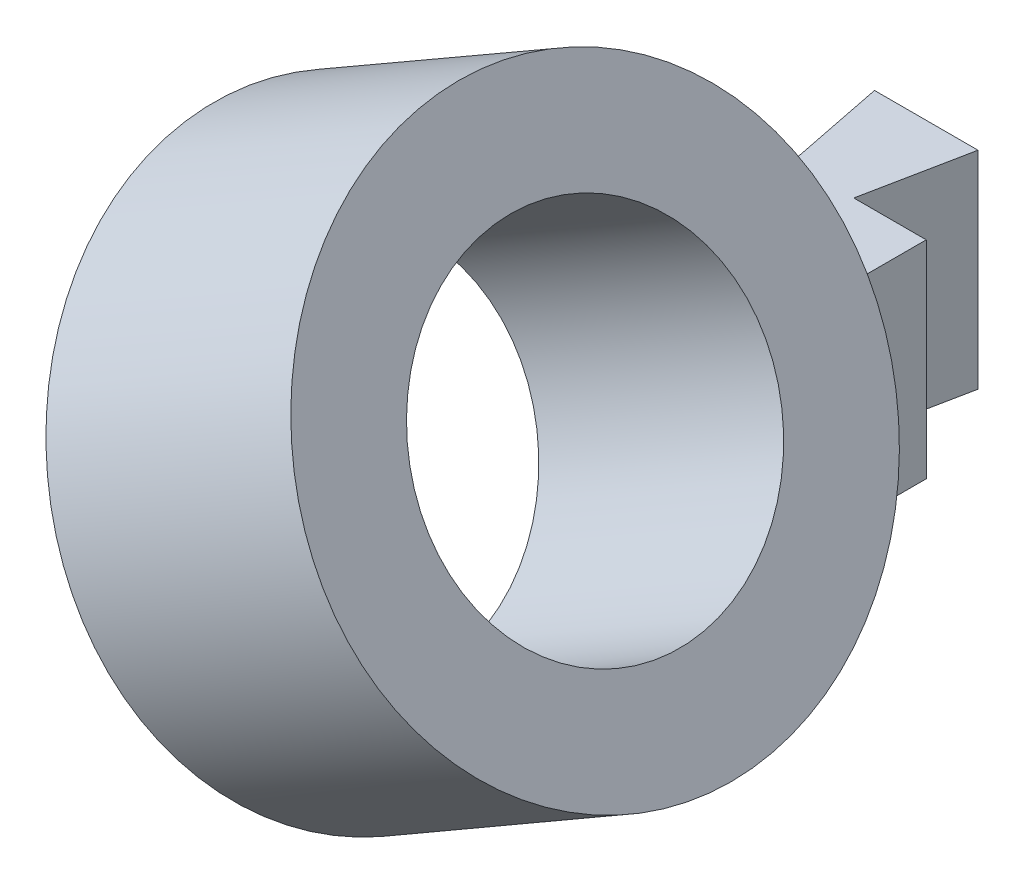
ISO-10303-21;
HEADER;
FILE_DESCRIPTION(('STEP AP214'),'2;1');
FILE_NAME('part.step','',(''),(''),'','','');
FILE_SCHEMA(('AUTOMOTIVE_DESIGN { 1 0 10303 214 1 1 1 1 }'));
ENDSEC;
DATA;
#1=APPLICATION_CONTEXT('core data for automotive mechanical design processes');
#2=APPLICATION_PROTOCOL_DEFINITION('international standard','automotive_design',2000,#1);
#3=PRODUCT_CONTEXT('',#1,'mechanical');
#4=PRODUCT('Part','Part','',(#3));
#5=PRODUCT_RELATED_PRODUCT_CATEGORY('part','',(#4));
#6=PRODUCT_DEFINITION_FORMATION('','',#4);
#7=PRODUCT_DEFINITION_CONTEXT('part definition',#1,'design');
#8=PRODUCT_DEFINITION('design','',#6,#7);
#9=PRODUCT_DEFINITION_SHAPE('','',#8);
#10=(LENGTH_UNIT() NAMED_UNIT(*) SI_UNIT(.MILLI.,.METRE.));
#11=(NAMED_UNIT(*) PLANE_ANGLE_UNIT() SI_UNIT($,.RADIAN.));
#12=(NAMED_UNIT(*) SI_UNIT($,.STERADIAN.) SOLID_ANGLE_UNIT());
#13=UNCERTAINTY_MEASURE_WITH_UNIT(LENGTH_MEASURE(1.E-05),#10,'distance_accuracy_value','');
#14=(GEOMETRIC_REPRESENTATION_CONTEXT(3) GLOBAL_UNCERTAINTY_ASSIGNED_CONTEXT((#13)) GLOBAL_UNIT_ASSIGNED_CONTEXT((#10,
#11,#12)) REPRESENTATION_CONTEXT('',''));
#15=CARTESIAN_POINT('',(0.,0.,0.));
#16=DIRECTION('',(0.,0.,1.));
#17=DIRECTION('',(1.,0.,0.));
#18=AXIS2_PLACEMENT_3D('',#15,#16,#17);
#19=CARTESIAN_POINT('',(-11.8301270189222,3.16987298107775,16.));
#20=DIRECTION('',(0.866025403784436,0.500000000000004,0.));
#21=DIRECTION('',(-0.500000000000004,0.866025403784436,0.));
#22=AXIS2_PLACEMENT_3D('',#19,#20,#21);
#23=CYLINDRICAL_SURFACE('',#22,13.15);
#24=CARTESIAN_POINT('',(0.,10.,16.));
#25=DIRECTION('',(0.,-1.,0.));
#26=DIRECTION('',(1.,0.,0.));
#27=AXIS2_PLACEMENT_3D('',#24,#25,#26);
#28=ELLIPSE('',#27,26.2999999999998,13.15);
#29=CARTESIAN_POINT('',(0.,10.,2.85));
#30=VERTEX_POINT('',#29);
#31=CARTESIAN_POINT('',(-10.,10.,3.83766058687723));
#32=VERTEX_POINT('',#31);
#33=EDGE_CURVE('E194',#30,#32,#28,.F.);
#34=ORIENTED_EDGE('',*,*,#33,.T.);
#35=CARTESIAN_POINT('',(-10.,4.22649730810368,16.));
#36=DIRECTION('',(1.,0.,0.));
#37=DIRECTION('',(0.,1.,0.));
#38=AXIS2_PLACEMENT_3D('',#35,#36,#37);
#39=ELLIPSE('',#38,15.1843120796872,13.15);
#40=CARTESIAN_POINT('',(-9.99999999999999,0.,3.36967774051492));
#41=VERTEX_POINT('',#40);
#42=EDGE_CURVE('E188',#32,#41,#39,.F.);
#43=ORIENTED_EDGE('',*,*,#42,.T.);
#44=CARTESIAN_POINT('',(-11.8301270189222,3.16987298107775,16.));
#45=DIRECTION('',(-0.866025403784436,-0.500000000000004,0.));
#46=DIRECTION('',(0.500000000000004,-0.866025403784436,0.));
#47=AXIS2_PLACEMENT_3D('',#44,#45,#46);
#48=CIRCLE('',#47,13.15);
#49=EDGE_CURVE('E209',#41,#41,#48,.T.);
#50=ORIENTED_EDGE('',*,*,#49,.F.);
#51=CARTESIAN_POINT('',(-17.3205080756886,0.,16.));
#52=DIRECTION('',(0.,1.,0.));
#53=DIRECTION('',(1.,0.,0.));
#54=AXIS2_PLACEMENT_3D('',#51,#52,#53);
#55=ELLIPSE('',#54,26.2999999999998,13.15);
#56=CARTESIAN_POINT('',(0.,0.,6.10442017868582));
#57=VERTEX_POINT('',#56);
#58=EDGE_CURVE('E146',#41,#57,#55,.F.);
#59=ORIENTED_EDGE('',*,*,#58,.T.);
#60=CARTESIAN_POINT('',(0.,10.,16.));
#61=DIRECTION('',(-1.,0.,0.));
#62=DIRECTION('',(0.,1.,0.));
#63=AXIS2_PLACEMENT_3D('',#60,#61,#62);
#64=ELLIPSE('',#63,15.1843120796872,13.15);
#65=EDGE_CURVE('E191',#57,#30,#64,.F.);
#66=ORIENTED_EDGE('',*,*,#65,.T.);
#67=CARTESIAN_POINT('',(0.,10.,16.));
#68=DIRECTION('',(-0.866025403784436,-0.500000000000004,0.));
#69=DIRECTION('',(0.500000000000004,-0.866025403784436,0.));
#70=AXIS2_PLACEMENT_3D('',#67,#68,#69);
#71=CIRCLE('',#70,13.15);
#72=EDGE_CURVE('E207',#30,#30,#71,.T.);
#73=ORIENTED_EDGE('',*,*,#72,.T.);
#74=EDGE_LOOP('',(#34,#43,#50,#59,#66,#73));
#75=FACE_BOUND('',#74,.T.);
#76=ADVANCED_FACE('F41',(#75),#23,.T.);
#77=CARTESIAN_POINT('',(0.,10.,0.));
#78=DIRECTION('',(-1.,0.,0.));
#79=DIRECTION('',(0.,0.,1.));
#80=AXIS2_PLACEMENT_3D('',#77,#78,#79);
#81=PLANE('',#80);
#82=DIRECTION('',(0.,0.,-1.));
#83=VECTOR('',#82,1.);
#84=CARTESIAN_POINT('',(0.,0.,0.));
#85=LINE('',#84,#83);
#86=CARTESIAN_POINT('',(0.,0.,0.));
#87=VERTEX_POINT('',#86);
#88=EDGE_CURVE('E142',#57,#87,#85,.T.);
#89=ORIENTED_EDGE('',*,*,#88,.T.);
#90=DIRECTION('',(0.,-1.,0.));
#91=VECTOR('',#90,1.);
#92=CARTESIAN_POINT('',(0.,10.,0.));
#93=LINE('',#92,#91);
#94=CARTESIAN_POINT('',(0.,10.,0.));
#95=VERTEX_POINT('',#94);
#96=EDGE_CURVE('E11',#95,#87,#93,.T.);
#97=ORIENTED_EDGE('',*,*,#96,.F.);
#98=DIRECTION('',(0.,0.,-1.));
#99=VECTOR('',#98,1.);
#100=CARTESIAN_POINT('',(0.,10.,0.));
#101=LINE('',#100,#99);
#102=EDGE_CURVE('E98',#30,#95,#101,.T.);
#103=ORIENTED_EDGE('',*,*,#102,.F.);
#104=ORIENTED_EDGE('',*,*,#65,.F.);
#105=EDGE_LOOP('',(#89,#97,#103,#104));
#106=FACE_BOUND('',#105,.T.);
#107=ADVANCED_FACE('F43',(#106),#81,.F.);
#108=CARTESIAN_POINT('',(0.,10.,0.));
#109=DIRECTION('',(0.,0.,1.));
#110=DIRECTION('',(1.,0.,0.));
#111=AXIS2_PLACEMENT_3D('',#108,#109,#110);
#112=PLANE('',#111);
#113=DIRECTION('',(-1.,0.,0.));
#114=VECTOR('',#113,1.);
#115=CARTESIAN_POINT('',(0.,0.,0.));
#116=LINE('',#115,#114);
#117=CARTESIAN_POINT('',(-3.5,0.,0.));
#118=VERTEX_POINT('',#117);
#119=EDGE_CURVE('E145',#87,#118,#116,.T.);
#120=ORIENTED_EDGE('',*,*,#119,.T.);
#121=DIRECTION('',(0.,-1.,0.));
#122=VECTOR('',#121,1.);
#123=CARTESIAN_POINT('',(-3.5,10.,0.));
#124=LINE('',#123,#122);
#125=CARTESIAN_POINT('',(-3.5,10.,0.));
#126=VERTEX_POINT('',#125);
#127=EDGE_CURVE('E51',#126,#118,#124,.T.);
#128=ORIENTED_EDGE('',*,*,#127,.F.);
#129=DIRECTION('',(-1.,0.,0.));
#130=VECTOR('',#129,1.);
#131=CARTESIAN_POINT('',(0.,10.,0.));
#132=LINE('',#131,#130);
#133=EDGE_CURVE('E223',#95,#126,#132,.T.);
#134=ORIENTED_EDGE('',*,*,#133,.F.);
#135=ORIENTED_EDGE('',*,*,#96,.T.);
#136=EDGE_LOOP('',(#120,#128,#134,#135));
#137=FACE_BOUND('',#136,.T.);
#138=ADVANCED_FACE('F226',(#137),#112,.F.);
#139=CARTESIAN_POINT('',(-3.36538461538462,10.,-0.673076923076922));
#140=DIRECTION('',(-0.98058067569092,0.,-0.196116135138184));
#141=DIRECTION('',(-0.196116135138184,0.,0.98058067569092));
#142=AXIS2_PLACEMENT_3D('',#139,#140,#141);
#143=PLANE('',#142);
#144=DIRECTION('',(0.196116135138184,0.,-0.98058067569092));
#145=VECTOR('',#144,1.);
#146=CARTESIAN_POINT('',(-3.36538461538462,0.,-0.673076923076922));
#147=LINE('',#146,#145);
#148=CARTESIAN_POINT('',(-2.5,0.,-5.));
#149=VERTEX_POINT('',#148);
#150=EDGE_CURVE('E149',#118,#149,#147,.T.);
#151=ORIENTED_EDGE('',*,*,#150,.T.);
#152=DIRECTION('',(0.,-1.,0.));
#153=VECTOR('',#152,1.);
#154=CARTESIAN_POINT('',(-2.5,10.,-5.));
#155=LINE('',#154,#153);
#156=CARTESIAN_POINT('',(-2.5,10.,-5.));
#157=VERTEX_POINT('',#156);
#158=EDGE_CURVE('E128',#157,#149,#155,.T.);
#159=ORIENTED_EDGE('',*,*,#158,.F.);
#160=DIRECTION('',(0.196116135138184,0.,-0.98058067569092));
#161=VECTOR('',#160,1.);
#162=CARTESIAN_POINT('',(-3.36538461538462,10.,-0.673076923076922));
#163=LINE('',#162,#161);
#164=EDGE_CURVE('E117',#126,#157,#163,.T.);
#165=ORIENTED_EDGE('',*,*,#164,.F.);
#166=ORIENTED_EDGE('',*,*,#127,.T.);
#167=EDGE_LOOP('',(#151,#159,#165,#166));
#168=FACE_BOUND('',#167,.T.);
#169=ADVANCED_FACE('F172',(#168),#143,.F.);
#170=CARTESIAN_POINT('',(0.,10.,-5.));
#171=DIRECTION('',(0.,0.,1.));
#172=DIRECTION('',(1.,0.,0.));
#173=AXIS2_PLACEMENT_3D('',#170,#171,#172);
#174=PLANE('',#173);
#175=DIRECTION('',(-1.,0.,0.));
#176=VECTOR('',#175,1.);
#177=CARTESIAN_POINT('',(0.,0.,-5.));
#178=LINE('',#177,#176);
#179=CARTESIAN_POINT('',(-7.5,0.,-5.));
#180=VERTEX_POINT('',#179);
#181=EDGE_CURVE('E126',#149,#180,#178,.T.);
#182=ORIENTED_EDGE('',*,*,#181,.T.);
#183=DIRECTION('',(0.,-1.,0.));
#184=VECTOR('',#183,1.);
#185=CARTESIAN_POINT('',(-7.5,10.,-5.));
#186=LINE('',#185,#184);
#187=CARTESIAN_POINT('',(-7.5,10.,-5.));
#188=VERTEX_POINT('',#187);
#189=EDGE_CURVE('E123',#188,#180,#186,.T.);
#190=ORIENTED_EDGE('',*,*,#189,.F.);
#191=DIRECTION('',(-1.,0.,0.));
#192=VECTOR('',#191,1.);
#193=CARTESIAN_POINT('',(0.,10.,-5.));
#194=LINE('',#193,#192);
#195=EDGE_CURVE('E111',#157,#188,#194,.T.);
#196=ORIENTED_EDGE('',*,*,#195,.F.);
#197=ORIENTED_EDGE('',*,*,#158,.T.);
#198=EDGE_LOOP('',(#182,#190,#196,#197));
#199=FACE_BOUND('',#198,.T.);
#200=ADVANCED_FACE('F124',(#199),#174,.F.);
#201=CARTESIAN_POINT('',(-6.25,10.,1.25));
#202=DIRECTION('',(0.98058067569092,0.,-0.196116135138184));
#203=DIRECTION('',(-0.196116135138184,0.,-0.98058067569092));
#204=AXIS2_PLACEMENT_3D('',#201,#202,#203);
#205=PLANE('',#204);
#206=DIRECTION('',(0.196116135138184,0.,0.98058067569092));
#207=VECTOR('',#206,1.);
#208=CARTESIAN_POINT('',(-6.25,0.,1.25));
#209=LINE('',#208,#207);
#210=CARTESIAN_POINT('',(-6.5,0.,0.));
#211=VERTEX_POINT('',#210);
#212=EDGE_CURVE('E83',#180,#211,#209,.T.);
#213=ORIENTED_EDGE('',*,*,#212,.T.);
#214=DIRECTION('',(0.,-1.,0.));
#215=VECTOR('',#214,1.);
#216=CARTESIAN_POINT('',(-6.5,10.,0.));
#217=LINE('',#216,#215);
#218=CARTESIAN_POINT('',(-6.5,10.,0.));
#219=VERTEX_POINT('',#218);
#220=EDGE_CURVE('E129',#219,#211,#217,.T.);
#221=ORIENTED_EDGE('',*,*,#220,.F.);
#222=DIRECTION('',(0.196116135138184,0.,0.98058067569092));
#223=VECTOR('',#222,1.);
#224=CARTESIAN_POINT('',(-6.25,10.,1.25));
#225=LINE('',#224,#223);
#226=EDGE_CURVE('E115',#188,#219,#225,.T.);
#227=ORIENTED_EDGE('',*,*,#226,.F.);
#228=ORIENTED_EDGE('',*,*,#189,.T.);
#229=EDGE_LOOP('',(#213,#221,#227,#228));
#230=FACE_BOUND('',#229,.T.);
#231=ADVANCED_FACE('F131',(#230),#205,.F.);
#232=CARTESIAN_POINT('',(0.,10.,0.));
#233=DIRECTION('',(0.,0.,1.));
#234=DIRECTION('',(1.,0.,0.));
#235=AXIS2_PLACEMENT_3D('',#232,#233,#234);
#236=PLANE('',#235);
#237=DIRECTION('',(-1.,0.,0.));
#238=VECTOR('',#237,1.);
#239=CARTESIAN_POINT('',(0.,0.,0.));
#240=LINE('',#239,#238);
#241=CARTESIAN_POINT('',(-10.,0.,0.));
#242=VERTEX_POINT('',#241);
#243=EDGE_CURVE('E89',#211,#242,#240,.T.);
#244=ORIENTED_EDGE('',*,*,#243,.T.);
#245=DIRECTION('',(0.,-1.,0.));
#246=VECTOR('',#245,1.);
#247=CARTESIAN_POINT('',(-10.,10.,0.));
#248=LINE('',#247,#246);
#249=CARTESIAN_POINT('',(-10.,10.,0.));
#250=VERTEX_POINT('',#249);
#251=EDGE_CURVE('E141',#250,#242,#248,.T.);
#252=ORIENTED_EDGE('',*,*,#251,.F.);
#253=DIRECTION('',(-1.,0.,0.));
#254=VECTOR('',#253,1.);
#255=CARTESIAN_POINT('',(0.,10.,0.));
#256=LINE('',#255,#254);
#257=EDGE_CURVE('E59',#219,#250,#256,.T.);
#258=ORIENTED_EDGE('',*,*,#257,.F.);
#259=ORIENTED_EDGE('',*,*,#220,.T.);
#260=EDGE_LOOP('',(#244,#252,#258,#259));
#261=FACE_BOUND('',#260,.T.);
#262=ADVANCED_FACE('F260',(#261),#236,.F.);
#263=CARTESIAN_POINT('',(-10.,10.,0.));
#264=DIRECTION('',(1.,0.,0.));
#265=DIRECTION('',(0.,0.,-1.));
#266=AXIS2_PLACEMENT_3D('',#263,#264,#265);
#267=PLANE('',#266);
#268=DIRECTION('',(0.,0.,1.));
#269=VECTOR('',#268,1.);
#270=CARTESIAN_POINT('',(-10.,0.,0.));
#271=LINE('',#270,#269);
#272=EDGE_CURVE('E158',#242,#41,#271,.T.);
#273=ORIENTED_EDGE('',*,*,#272,.T.);
#274=ORIENTED_EDGE('',*,*,#42,.F.);
#275=DIRECTION('',(0.,0.,1.));
#276=VECTOR('',#275,1.);
#277=CARTESIAN_POINT('',(-10.,10.,0.));
#278=LINE('',#277,#276);
#279=EDGE_CURVE('E135',#250,#32,#278,.T.);
#280=ORIENTED_EDGE('',*,*,#279,.F.);
#281=ORIENTED_EDGE('',*,*,#251,.T.);
#282=EDGE_LOOP('',(#273,#274,#280,#281));
#283=FACE_BOUND('',#282,.T.);
#284=ADVANCED_FACE('F185',(#283),#267,.F.);
#285=CARTESIAN_POINT('',(0.,10.,0.));
#286=DIRECTION('',(0.,1.,0.));
#287=DIRECTION('',(0.,0.,1.));
#288=AXIS2_PLACEMENT_3D('',#285,#286,#287);
#289=PLANE('',#288);
#290=ORIENTED_EDGE('',*,*,#279,.T.);
#291=ORIENTED_EDGE('',*,*,#33,.F.);
#292=ORIENTED_EDGE('',*,*,#102,.T.);
#293=ORIENTED_EDGE('',*,*,#133,.T.);
#294=ORIENTED_EDGE('',*,*,#164,.T.);
#295=ORIENTED_EDGE('',*,*,#195,.T.);
#296=ORIENTED_EDGE('',*,*,#226,.T.);
#297=ORIENTED_EDGE('',*,*,#257,.T.);
#298=EDGE_LOOP('',(#290,#291,#292,#293,#294,#295,#296,#297));
#299=FACE_BOUND('',#298,.T.);
#300=ADVANCED_FACE('F113',(#299),#289,.T.);
#301=CARTESIAN_POINT('',(0.,0.,0.));
#302=DIRECTION('',(0.,1.,0.));
#303=DIRECTION('',(0.,0.,1.));
#304=AXIS2_PLACEMENT_3D('',#301,#302,#303);
#305=PLANE('',#304);
#306=ORIENTED_EDGE('',*,*,#88,.F.);
#307=ORIENTED_EDGE('',*,*,#58,.F.);
#308=ORIENTED_EDGE('',*,*,#272,.F.);
#309=ORIENTED_EDGE('',*,*,#243,.F.);
#310=ORIENTED_EDGE('',*,*,#212,.F.);
#311=ORIENTED_EDGE('',*,*,#181,.F.);
#312=ORIENTED_EDGE('',*,*,#150,.F.);
#313=ORIENTED_EDGE('',*,*,#119,.F.);
#314=EDGE_LOOP('',(#306,#307,#308,#309,#310,#311,#312,#313));
#315=FACE_BOUND('',#314,.T.);
#316=ADVANCED_FACE('F178',(#315),#305,.F.);
#317=CARTESIAN_POINT('',(-11.8301270189222,3.16987298107775,16.));
#318=DIRECTION('',(-0.866025403784436,-0.500000000000004,0.));
#319=DIRECTION('',(0.500000000000004,-0.866025403784436,0.));
#320=AXIS2_PLACEMENT_3D('',#317,#318,#319);
#321=PLANE('',#320);
#322=ORIENTED_EDGE('',*,*,#49,.T.);
#323=EDGE_LOOP('',(#322));
#324=FACE_BOUND('',#323,.T.);
#325=CARTESIAN_POINT('',(-11.8301270189222,3.16987298107775,16.));
#326=DIRECTION('',(-0.866025403784436,-0.500000000000004,0.));
#327=DIRECTION('',(0.500000000000004,-0.866025403784436,0.));
#328=AXIS2_PLACEMENT_3D('',#325,#326,#327);
#329=CIRCLE('',#328,8.15);
#330=CARTESIAN_POINT('',(-15.9051270189222,10.2279800219209,16.));
#331=VERTEX_POINT('',#330);
#332=EDGE_CURVE('E202',#331,#331,#329,.T.);
#333=ORIENTED_EDGE('',*,*,#332,.F.);
#334=EDGE_LOOP('',(#333));
#335=FACE_BOUND('',#334,.T.);
#336=ADVANCED_FACE('F229',(#324,#335),#321,.T.);
#337=CARTESIAN_POINT('',(0.,10.,16.));
#338=DIRECTION('',(-0.866025403784436,-0.500000000000004,0.));
#339=DIRECTION('',(0.500000000000004,-0.866025403784436,0.));
#340=AXIS2_PLACEMENT_3D('',#337,#338,#339);
#341=PLANE('',#340);
#342=ORIENTED_EDGE('',*,*,#72,.F.);
#343=EDGE_LOOP('',(#342));
#344=FACE_BOUND('',#343,.T.);
#345=CARTESIAN_POINT('',(0.,10.,16.));
#346=DIRECTION('',(-0.866025403784436,-0.500000000000004,0.));
#347=DIRECTION('',(0.500000000000004,-0.866025403784436,0.));
#348=AXIS2_PLACEMENT_3D('',#345,#346,#347);
#349=CIRCLE('',#348,8.15);
#350=CARTESIAN_POINT('',(-4.07500000000002,17.0581070408432,16.));
#351=VERTEX_POINT('',#350);
#352=EDGE_CURVE('E198',#351,#351,#349,.T.);
#353=ORIENTED_EDGE('',*,*,#352,.T.);
#354=EDGE_LOOP('',(#353));
#355=FACE_BOUND('',#354,.T.);
#356=ADVANCED_FACE('F232',(#344,#355),#341,.F.);
#357=CARTESIAN_POINT('',(-11.8301270189222,3.16987298107775,16.));
#358=DIRECTION('',(0.866025403784436,0.500000000000004,0.));
#359=DIRECTION('',(-0.500000000000004,0.866025403784436,0.));
#360=AXIS2_PLACEMENT_3D('',#357,#358,#359);
#361=CYLINDRICAL_SURFACE('',#360,8.15);
#362=CARTESIAN_POINT('',(-15.9051270189222,10.2279800219209,16.));
#363=CARTESIAN_POINT('',(-15.7818965291418,10.299127178368,16.));
#364=CARTESIAN_POINT('',(-15.6586660393613,10.3702743348151,16.));
#365=CARTESIAN_POINT('',(-15.4122050598004,10.5125686477093,16.));
#366=CARTESIAN_POINT('',(-15.28897457002,10.5837158041564,16.));
#367=CARTESIAN_POINT('',(-15.0425135904591,10.7260101170507,16.));
#368=CARTESIAN_POINT('',(-14.9192831006787,10.7971572734978,16.));
#369=CARTESIAN_POINT('',(-14.6728221211178,10.939451586392,16.));
#370=CARTESIAN_POINT('',(-14.5495916313374,11.0105987428391,16.));
#371=CARTESIAN_POINT('',(-14.3031306517765,11.1528930557333,16.));
#372=CARTESIAN_POINT('',(-14.179900161996,11.2240402121804,16.));
#373=CARTESIAN_POINT('',(-13.9334391824352,11.3663345250746,16.));
#374=CARTESIAN_POINT('',(-13.8102086926547,11.4374816815217,16.));
#375=CARTESIAN_POINT('',(-13.5637477130938,11.5797759944159,16.));
#376=CARTESIAN_POINT('',(-13.4405172233134,11.650923150863,16.));
#377=CARTESIAN_POINT('',(-13.1940562437525,11.7932174637573,16.));
#378=CARTESIAN_POINT('',(-13.0708257539721,11.8643646202044,16.));
#379=CARTESIAN_POINT('',(-12.8243647744112,12.0066589330986,16.));
#380=CARTESIAN_POINT('',(-12.7011342846308,12.0778060895457,16.));
#381=CARTESIAN_POINT('',(-12.4546733050699,12.2201004024399,16.));
#382=CARTESIAN_POINT('',(-12.3314428152895,12.291247558887,16.));
#383=CARTESIAN_POINT('',(-12.0849818357286,12.4335418717812,16.));
#384=CARTESIAN_POINT('',(-11.9617513459481,12.5046890282283,16.));
#385=CARTESIAN_POINT('',(-11.7152903663873,12.6469833411225,16.));
#386=CARTESIAN_POINT('',(-11.5920598766068,12.7181304975696,16.));
#387=CARTESIAN_POINT('',(-11.3455988970459,12.8604248104639,16.));
#388=CARTESIAN_POINT('',(-11.2223684072655,12.931571966911,16.));
#389=CARTESIAN_POINT('',(-10.9759074277046,13.0738662798052,16.));
#390=CARTESIAN_POINT('',(-10.8526769379242,13.1450134362523,16.));
#391=CARTESIAN_POINT('',(-10.6062159583633,13.2873077491465,16.));
#392=CARTESIAN_POINT('',(-10.4829854685829,13.3584549055936,16.));
#393=CARTESIAN_POINT('',(-10.236524489022,13.5007492184878,16.));
#394=CARTESIAN_POINT('',(-10.1132939992415,13.5718963749349,16.));
#395=CARTESIAN_POINT('',(-9.86683301968067,13.7141906878291,16.));
#396=CARTESIAN_POINT('',(-9.74360252990023,13.7853378442762,16.));
#397=CARTESIAN_POINT('',(-9.49714155033935,13.9276321571705,16.));
#398=CARTESIAN_POINT('',(-9.37391106055891,13.9987793136176,16.));
#399=CARTESIAN_POINT('',(-9.12745008099803,14.1410736265118,16.));
#400=CARTESIAN_POINT('',(-9.00421959121759,14.2122207829589,16.));
#401=CARTESIAN_POINT('',(-8.75775861165671,14.3545150958531,16.));
#402=CARTESIAN_POINT('',(-8.63452812187627,14.4256622523002,16.));
#403=CARTESIAN_POINT('',(-8.3880671423154,14.5679565651944,16.));
#404=CARTESIAN_POINT('',(-8.26483665253496,14.6391037216415,16.));
#405=CARTESIAN_POINT('',(-8.01837567297408,14.7813980345357,16.));
#406=CARTESIAN_POINT('',(-7.89514518319364,14.8525451909829,16.));
#407=CARTESIAN_POINT('',(-7.64868420363276,14.9948395038771,16.));
#408=CARTESIAN_POINT('',(-7.52545371385232,15.0659866603242,16.));
#409=CARTESIAN_POINT('',(-7.27899273429144,15.2082809732184,16.));
#410=CARTESIAN_POINT('',(-7.155762244511,15.2794281296655,16.));
#411=CARTESIAN_POINT('',(-6.90930126495012,15.4217224425597,16.));
#412=CARTESIAN_POINT('',(-6.78607077516968,15.4928695990068,16.));
#413=CARTESIAN_POINT('',(-6.53960979560881,15.635163911901,16.));
#414=CARTESIAN_POINT('',(-6.41637930582837,15.7063110683481,16.));
#415=CARTESIAN_POINT('',(-6.16991832626749,15.8486053812423,16.));
#416=CARTESIAN_POINT('',(-6.04668783648705,15.9197525376895,16.));
#417=CARTESIAN_POINT('',(-5.80022685692617,16.0620468505837,16.));
#418=CARTESIAN_POINT('',(-5.67699636714573,16.1331940070308,16.));
#419=CARTESIAN_POINT('',(-5.43053538758485,16.275488319925,16.));
#420=CARTESIAN_POINT('',(-5.30730489780441,16.3466354763721,16.));
#421=CARTESIAN_POINT('',(-5.06084391824353,16.4889297892663,16.));
#422=CARTESIAN_POINT('',(-4.93761342846309,16.5600769457134,16.));
#423=CARTESIAN_POINT('',(-4.69115244890222,16.7023712586076,16.));
#424=CARTESIAN_POINT('',(-4.56792195912178,16.7735184150547,16.));
#425=CARTESIAN_POINT('',(-4.3214609795609,16.9158127279489,16.));
#426=CARTESIAN_POINT('',(-4.19823048978046,16.9869598843961,16.));
#427=CARTESIAN_POINT('',(-4.07500000000002,17.0581070408432,16.));
#428=B_SPLINE_CURVE_WITH_KNOTS('',3,(#362,#363,#364,#365,#366,#367,#368,#369,#370,#371,#372,
#373,#374,#375,#376,#377,#378,#379,#380,#381,#382,#383,#384,#385,#386,#387,#388,#389,#390,#391,
#392,#393,#394,#395,#396,#397,#398,#399,#400,#401,#402,#403,#404,#405,#406,#407,#408,#409,#410,
#411,#412,#413,#414,#415,#416,#417,#418,#419,#420,#421,#422,#423,#424,#425,#426,#427),
.UNSPECIFIED.,.F.,.F.,(4,2,2,2,2,2,2,2,2,2,2,2,2,2,2,2,2,2,2,2,2,2,2,2,2,2,2,2,2,2,2,2,4),(0.,
0.426882938682635,0.853765877365274,1.28064881604791,1.70753175473055,2.13441469341319,
2.56129763209582,2.98818057077846,3.4150635094611,3.84194644814374,4.26882938682638,
4.69571232550901,5.12259526419165,5.54947820287429,5.97636114155693,6.40324408023956,
6.8301270189222,7.25700995760484,7.68389289628748,8.11077583497012,8.53765877365275,
8.96454171233539,9.39142465101803,9.81830758970066,10.2451905283833,10.6720734670659,
11.0989564057486,11.5258393444312,11.9527222831139,12.3796052217965,12.8064881604791,
13.2333710991618,13.6602540378444),.UNSPECIFIED.);
#429=EDGE_CURVE('BSEAM236',#331,#351,#428,.T.);
#430=ORIENTED_EDGE('',*,*,#332,.T.);
#431=ORIENTED_EDGE('',*,*,#352,.F.);
#432=ORIENTED_EDGE('',*,*,#429,.T.);
#433=ORIENTED_EDGE('',*,*,#429,.F.);
#434=EDGE_LOOP('',(#430,#432,#431,#433));
#435=FACE_BOUND('',#434,.T.);
#436=ADVANCED_FACE('F236',(#435),#361,.F.);
#437=CLOSED_SHELL('',(#76,#107,#138,#169,#200,#231,#262,#284,#300,#316,#336,#356,#436));
#438=MANIFOLD_SOLID_BREP('B2',#437);
#439=ADVANCED_BREP_SHAPE_REPRESENTATION('',(#18,#438),#14);
#440=SHAPE_DEFINITION_REPRESENTATION(#9,#439);
ENDSEC;
END-ISO-10303-21;
